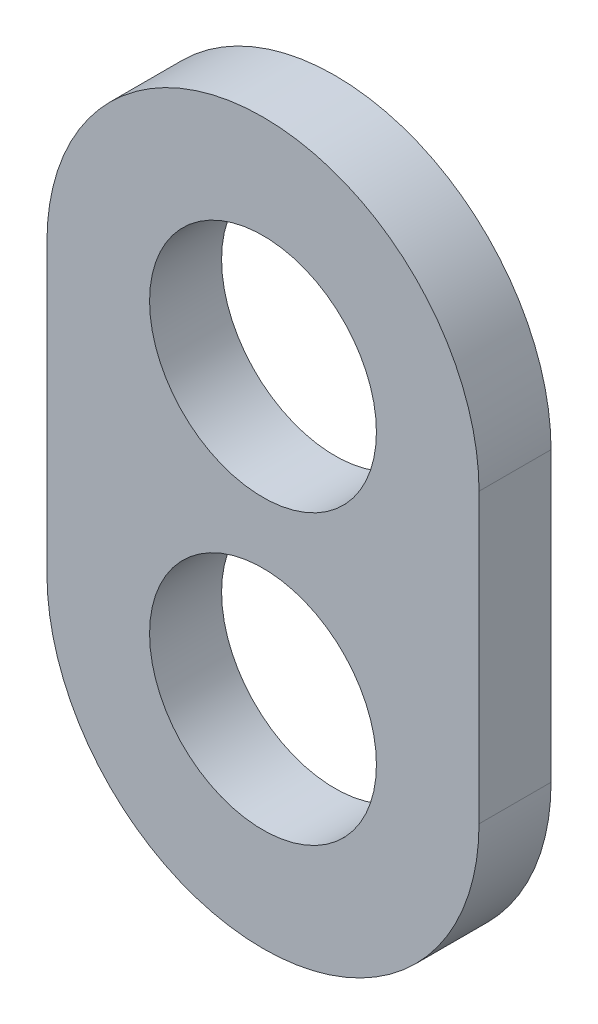
ISO-10303-21;
HEADER;
FILE_DESCRIPTION(('STEP AP214'),'2;1');
FILE_NAME('part.step','',(''),(''),'','','');
FILE_SCHEMA(('AUTOMOTIVE_DESIGN { 1 0 10303 214 1 1 1 1 }'));
ENDSEC;
DATA;
#1=APPLICATION_CONTEXT('core data for automotive mechanical design processes');
#2=APPLICATION_PROTOCOL_DEFINITION('international standard','automotive_design',2000,#1);
#3=PRODUCT_CONTEXT('',#1,'mechanical');
#4=PRODUCT('Part','Part','',(#3));
#5=PRODUCT_RELATED_PRODUCT_CATEGORY('part','',(#4));
#6=PRODUCT_DEFINITION_FORMATION('','',#4);
#7=PRODUCT_DEFINITION_CONTEXT('part definition',#1,'design');
#8=PRODUCT_DEFINITION('design','',#6,#7);
#9=PRODUCT_DEFINITION_SHAPE('','',#8);
#10=(LENGTH_UNIT() NAMED_UNIT(*) SI_UNIT(.MILLI.,.METRE.));
#11=(NAMED_UNIT(*) PLANE_ANGLE_UNIT() SI_UNIT($,.RADIAN.));
#12=(NAMED_UNIT(*) SI_UNIT($,.STERADIAN.) SOLID_ANGLE_UNIT());
#13=UNCERTAINTY_MEASURE_WITH_UNIT(LENGTH_MEASURE(1.E-05),#10,'distance_accuracy_value','');
#14=(GEOMETRIC_REPRESENTATION_CONTEXT(3) GLOBAL_UNCERTAINTY_ASSIGNED_CONTEXT((#13)) GLOBAL_UNIT_ASSIGNED_CONTEXT((#10,
#11,#12)) REPRESENTATION_CONTEXT('',''));
#15=CARTESIAN_POINT('',(0.,0.,0.));
#16=DIRECTION('',(0.,0.,1.));
#17=DIRECTION('',(1.,0.,0.));
#18=AXIS2_PLACEMENT_3D('',#15,#16,#17);
#19=CARTESIAN_POINT('',(0.,4.,2.));
#20=DIRECTION('',(0.,0.,1.));
#21=DIRECTION('',(1.,0.,0.));
#22=AXIS2_PLACEMENT_3D('',#19,#20,#21);
#23=PLANE('',#22);
#24=CARTESIAN_POINT('',(0.,4.,2.));
#25=DIRECTION('',(0.,0.,1.));
#26=DIRECTION('',(1.,0.,0.));
#27=AXIS2_PLACEMENT_3D('',#24,#25,#26);
#28=CIRCLE('',#27,3.15);
#29=CARTESIAN_POINT('',(3.15,4.,2.));
#30=VERTEX_POINT('',#29);
#31=EDGE_CURVE('E102',#30,#30,#28,.T.);
#32=ORIENTED_EDGE('',*,*,#31,.F.);
#33=EDGE_LOOP('',(#32));
#34=FACE_BOUND('',#33,.T.);
#35=CARTESIAN_POINT('',(0.,4.,2.));
#36=DIRECTION('',(0.,0.,1.));
#37=DIRECTION('',(1.,0.,0.));
#38=AXIS2_PLACEMENT_3D('',#35,#36,#37);
#39=CIRCLE('',#38,6.);
#40=CARTESIAN_POINT('',(6.,4.,2.));
#41=VERTEX_POINT('',#40);
#42=CARTESIAN_POINT('',(-6.,4.,2.));
#43=VERTEX_POINT('',#42);
#44=EDGE_CURVE('E87',#41,#43,#39,.T.);
#45=ORIENTED_EDGE('',*,*,#44,.T.);
#46=DIRECTION('',(0.,-1.,0.));
#47=VECTOR('',#46,1.);
#48=CARTESIAN_POINT('',(-6.,4.,2.));
#49=LINE('',#48,#47);
#50=CARTESIAN_POINT('',(-6.,-4.,2.));
#51=VERTEX_POINT('',#50);
#52=EDGE_CURVE('E82',#43,#51,#49,.T.);
#53=ORIENTED_EDGE('',*,*,#52,.T.);
#54=CARTESIAN_POINT('',(0.,-4.,2.));
#55=DIRECTION('',(0.,0.,1.));
#56=DIRECTION('',(1.,0.,0.));
#57=AXIS2_PLACEMENT_3D('',#54,#55,#56);
#58=CIRCLE('',#57,6.);
#59=CARTESIAN_POINT('',(6.,-4.,2.));
#60=VERTEX_POINT('',#59);
#61=EDGE_CURVE('E85',#51,#60,#58,.T.);
#62=ORIENTED_EDGE('',*,*,#61,.T.);
#63=DIRECTION('',(0.,1.,0.));
#64=VECTOR('',#63,1.);
#65=CARTESIAN_POINT('',(6.,4.,2.));
#66=LINE('',#65,#64);
#67=EDGE_CURVE('E52',#60,#41,#66,.T.);
#68=ORIENTED_EDGE('',*,*,#67,.T.);
#69=EDGE_LOOP('',(#45,#53,#62,#68));
#70=FACE_BOUND('',#69,.T.);
#71=CARTESIAN_POINT('',(0.,-4.,2.));
#72=DIRECTION('',(0.,0.,1.));
#73=DIRECTION('',(-1.,0.,0.));
#74=AXIS2_PLACEMENT_3D('',#71,#72,#73);
#75=CIRCLE('',#74,3.15);
#76=CARTESIAN_POINT('',(-3.15,-4.,2.));
#77=VERTEX_POINT('',#76);
#78=EDGE_CURVE('E117',#77,#77,#75,.T.);
#79=ORIENTED_EDGE('',*,*,#78,.F.);
#80=EDGE_LOOP('',(#79));
#81=FACE_BOUND('',#80,.T.);
#82=ADVANCED_FACE('F35',(#34,#70,#81),#23,.T.);
#83=CARTESIAN_POINT('',(0.,4.,0.));
#84=DIRECTION('',(0.,0.,1.));
#85=DIRECTION('',(1.,0.,0.));
#86=AXIS2_PLACEMENT_3D('',#83,#84,#85);
#87=PLANE('',#86);
#88=CARTESIAN_POINT('',(0.,4.,0.));
#89=DIRECTION('',(0.,0.,1.));
#90=DIRECTION('',(1.,0.,0.));
#91=AXIS2_PLACEMENT_3D('',#88,#89,#90);
#92=CIRCLE('',#91,6.);
#93=CARTESIAN_POINT('',(6.,4.,0.));
#94=VERTEX_POINT('',#93);
#95=CARTESIAN_POINT('',(-6.,4.,0.));
#96=VERTEX_POINT('',#95);
#97=EDGE_CURVE('E99',#94,#96,#92,.T.);
#98=ORIENTED_EDGE('',*,*,#97,.F.);
#99=DIRECTION('',(0.,1.,0.));
#100=VECTOR('',#99,1.);
#101=CARTESIAN_POINT('',(6.,4.,0.));
#102=LINE('',#101,#100);
#103=CARTESIAN_POINT('',(6.,-4.,0.));
#104=VERTEX_POINT('',#103);
#105=EDGE_CURVE('E75',#104,#94,#102,.T.);
#106=ORIENTED_EDGE('',*,*,#105,.F.);
#107=CARTESIAN_POINT('',(0.,-4.,0.));
#108=DIRECTION('',(0.,0.,1.));
#109=DIRECTION('',(1.,0.,0.));
#110=AXIS2_PLACEMENT_3D('',#107,#108,#109);
#111=CIRCLE('',#110,6.);
#112=CARTESIAN_POINT('',(-6.,-4.,0.));
#113=VERTEX_POINT('',#112);
#114=EDGE_CURVE('E69',#113,#104,#111,.T.);
#115=ORIENTED_EDGE('',*,*,#114,.F.);
#116=DIRECTION('',(0.,-1.,0.));
#117=VECTOR('',#116,1.);
#118=CARTESIAN_POINT('',(-6.,4.,0.));
#119=LINE('',#118,#117);
#120=EDGE_CURVE('E91',#96,#113,#119,.T.);
#121=ORIENTED_EDGE('',*,*,#120,.F.);
#122=EDGE_LOOP('',(#98,#106,#115,#121));
#123=FACE_BOUND('',#122,.T.);
#124=CARTESIAN_POINT('',(0.,4.,0.));
#125=DIRECTION('',(0.,0.,1.));
#126=DIRECTION('',(1.,0.,0.));
#127=AXIS2_PLACEMENT_3D('',#124,#125,#126);
#128=CIRCLE('',#127,3.15);
#129=CARTESIAN_POINT('',(3.15,4.,0.));
#130=VERTEX_POINT('',#129);
#131=EDGE_CURVE('E114',#130,#130,#128,.T.);
#132=ORIENTED_EDGE('',*,*,#131,.T.);
#133=EDGE_LOOP('',(#132));
#134=FACE_BOUND('',#133,.T.);
#135=CARTESIAN_POINT('',(0.,-4.,0.));
#136=DIRECTION('',(0.,0.,1.));
#137=DIRECTION('',(-1.,0.,0.));
#138=AXIS2_PLACEMENT_3D('',#135,#136,#137);
#139=CIRCLE('',#138,3.15);
#140=CARTESIAN_POINT('',(-3.15,-4.,0.));
#141=VERTEX_POINT('',#140);
#142=EDGE_CURVE('E120',#141,#141,#139,.T.);
#143=ORIENTED_EDGE('',*,*,#142,.T.);
#144=EDGE_LOOP('',(#143));
#145=FACE_BOUND('',#144,.T.);
#146=ADVANCED_FACE('F110',(#123,#134,#145),#87,.F.);
#147=CARTESIAN_POINT('',(0.,4.,2.));
#148=DIRECTION('',(0.,0.,-1.));
#149=DIRECTION('',(-1.,0.,0.));
#150=AXIS2_PLACEMENT_3D('',#147,#148,#149);
#151=CYLINDRICAL_SURFACE('',#150,6.);
#152=ORIENTED_EDGE('',*,*,#97,.T.);
#153=DIRECTION('',(0.,0.,-1.));
#154=VECTOR('',#153,1.);
#155=CARTESIAN_POINT('',(-6.,4.,2.));
#156=LINE('',#155,#154);
#157=EDGE_CURVE('E11',#43,#96,#156,.T.);
#158=ORIENTED_EDGE('',*,*,#157,.F.);
#159=ORIENTED_EDGE('',*,*,#44,.F.);
#160=DIRECTION('',(0.,0.,-1.));
#161=VECTOR('',#160,1.);
#162=CARTESIAN_POINT('',(6.,4.,2.));
#163=LINE('',#162,#161);
#164=EDGE_CURVE('E95',#41,#94,#163,.T.);
#165=ORIENTED_EDGE('',*,*,#164,.T.);
#166=EDGE_LOOP('',(#152,#158,#159,#165));
#167=FACE_BOUND('',#166,.T.);
#168=ADVANCED_FACE('F37',(#167),#151,.T.);
#169=CARTESIAN_POINT('',(-6.,4.,2.));
#170=DIRECTION('',(1.,0.,0.));
#171=DIRECTION('',(0.,0.,-1.));
#172=AXIS2_PLACEMENT_3D('',#169,#170,#171);
#173=PLANE('',#172);
#174=ORIENTED_EDGE('',*,*,#120,.T.);
#175=DIRECTION('',(0.,0.,-1.));
#176=VECTOR('',#175,1.);
#177=CARTESIAN_POINT('',(-6.,-4.,2.));
#178=LINE('',#177,#176);
#179=EDGE_CURVE('E44',#51,#113,#178,.T.);
#180=ORIENTED_EDGE('',*,*,#179,.F.);
#181=ORIENTED_EDGE('',*,*,#52,.F.);
#182=ORIENTED_EDGE('',*,*,#157,.T.);
#183=EDGE_LOOP('',(#174,#180,#181,#182));
#184=FACE_BOUND('',#183,.T.);
#185=ADVANCED_FACE('F90',(#184),#173,.F.);
#186=CARTESIAN_POINT('',(0.,-4.,2.));
#187=DIRECTION('',(0.,0.,-1.));
#188=DIRECTION('',(-1.,0.,0.));
#189=AXIS2_PLACEMENT_3D('',#186,#187,#188);
#190=CYLINDRICAL_SURFACE('',#189,6.);
#191=ORIENTED_EDGE('',*,*,#114,.T.);
#192=DIRECTION('',(0.,0.,-1.));
#193=VECTOR('',#192,1.);
#194=CARTESIAN_POINT('',(6.,-4.,2.));
#195=LINE('',#194,#193);
#196=EDGE_CURVE('E92',#60,#104,#195,.T.);
#197=ORIENTED_EDGE('',*,*,#196,.F.);
#198=ORIENTED_EDGE('',*,*,#61,.F.);
#199=ORIENTED_EDGE('',*,*,#179,.T.);
#200=EDGE_LOOP('',(#191,#197,#198,#199));
#201=FACE_BOUND('',#200,.T.);
#202=ADVANCED_FACE('F93',(#201),#190,.T.);
#203=CARTESIAN_POINT('',(6.,4.,2.));
#204=DIRECTION('',(-1.,0.,0.));
#205=DIRECTION('',(0.,0.,1.));
#206=AXIS2_PLACEMENT_3D('',#203,#204,#205);
#207=PLANE('',#206);
#208=ORIENTED_EDGE('',*,*,#105,.T.);
#209=ORIENTED_EDGE('',*,*,#164,.F.);
#210=ORIENTED_EDGE('',*,*,#67,.F.);
#211=ORIENTED_EDGE('',*,*,#196,.T.);
#212=EDGE_LOOP('',(#208,#209,#210,#211));
#213=FACE_BOUND('',#212,.T.);
#214=ADVANCED_FACE('F107',(#213),#207,.F.);
#215=CARTESIAN_POINT('',(0.,4.,2.));
#216=DIRECTION('',(0.,0.,-1.));
#217=DIRECTION('',(-1.,0.,0.));
#218=AXIS2_PLACEMENT_3D('',#215,#216,#217);
#219=CYLINDRICAL_SURFACE('',#218,3.15);
#220=ORIENTED_EDGE('',*,*,#31,.T.);
#221=EDGE_LOOP('',(#220));
#222=FACE_BOUND('',#221,.T.);
#223=ORIENTED_EDGE('',*,*,#131,.F.);
#224=EDGE_LOOP('',(#223));
#225=FACE_BOUND('',#224,.T.);
#226=ADVANCED_FACE('F137',(#222,#225),#219,.F.);
#227=CARTESIAN_POINT('',(0.,-4.,2.));
#228=DIRECTION('',(0.,0.,-1.));
#229=DIRECTION('',(-1.,0.,0.));
#230=AXIS2_PLACEMENT_3D('',#227,#228,#229);
#231=CYLINDRICAL_SURFACE('',#230,3.15);
#232=ORIENTED_EDGE('',*,*,#78,.T.);
#233=EDGE_LOOP('',(#232));
#234=FACE_BOUND('',#233,.T.);
#235=ORIENTED_EDGE('',*,*,#142,.F.);
#236=EDGE_LOOP('',(#235));
#237=FACE_BOUND('',#236,.T.);
#238=ADVANCED_FACE('F126',(#234,#237),#231,.F.);
#239=CLOSED_SHELL('',(#82,#146,#168,#185,#202,#214,#226,#238));
#240=MANIFOLD_SOLID_BREP('B2',#239);
#241=ADVANCED_BREP_SHAPE_REPRESENTATION('',(#18,#240),#14);
#242=SHAPE_DEFINITION_REPRESENTATION(#9,#241);
ENDSEC;
END-ISO-10303-21;
